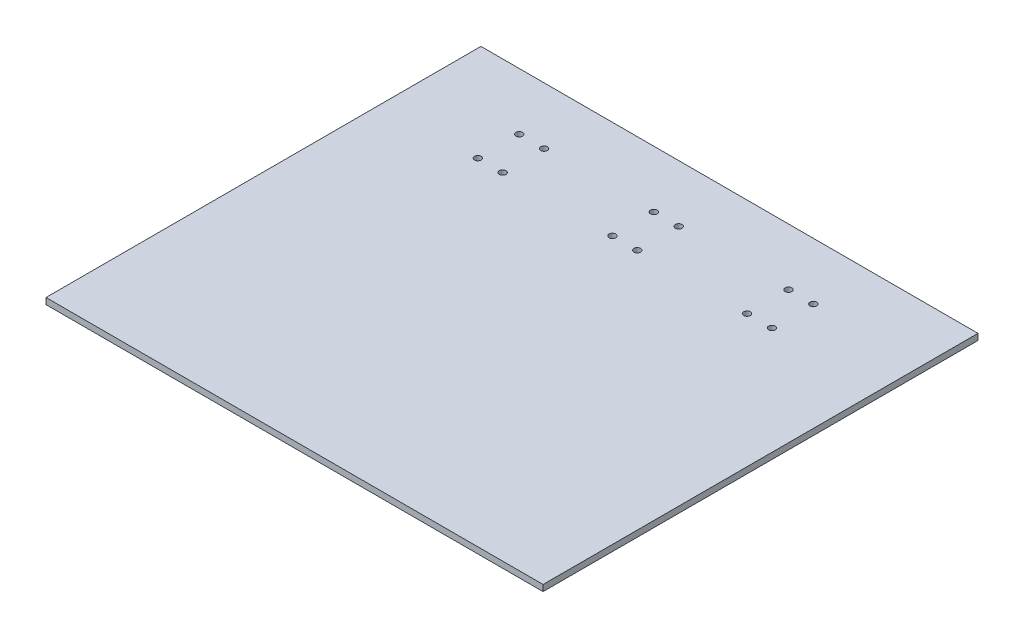
ISO-10303-21;
HEADER;
FILE_DESCRIPTION(('STEP AP214'),'2;1');
FILE_NAME('part.step','',(''),(''),'','','');
FILE_SCHEMA(('AUTOMOTIVE_DESIGN { 1 0 10303 214 1 1 1 1 }'));
ENDSEC;
DATA;
#1=APPLICATION_CONTEXT('core data for automotive mechanical design processes');
#2=APPLICATION_PROTOCOL_DEFINITION('international standard','automotive_design',2000,#1);
#3=PRODUCT_CONTEXT('',#1,'mechanical');
#4=PRODUCT('Part','Part','',(#3));
#5=PRODUCT_RELATED_PRODUCT_CATEGORY('part','',(#4));
#6=PRODUCT_DEFINITION_FORMATION('','',#4);
#7=PRODUCT_DEFINITION_CONTEXT('part definition',#1,'design');
#8=PRODUCT_DEFINITION('design','',#6,#7);
#9=PRODUCT_DEFINITION_SHAPE('','',#8);
#10=(LENGTH_UNIT() NAMED_UNIT(*) SI_UNIT(.MILLI.,.METRE.));
#11=(NAMED_UNIT(*) PLANE_ANGLE_UNIT() SI_UNIT($,.RADIAN.));
#12=(NAMED_UNIT(*) SI_UNIT($,.STERADIAN.) SOLID_ANGLE_UNIT());
#13=UNCERTAINTY_MEASURE_WITH_UNIT(LENGTH_MEASURE(1.E-05),#10,'distance_accuracy_value','');
#14=(GEOMETRIC_REPRESENTATION_CONTEXT(3) GLOBAL_UNCERTAINTY_ASSIGNED_CONTEXT((#13)) GLOBAL_UNIT_ASSIGNED_CONTEXT((#10,
#11,#12)) REPRESENTATION_CONTEXT('',''));
#15=CARTESIAN_POINT('',(0.,0.,0.));
#16=DIRECTION('',(0.,0.,1.));
#17=DIRECTION('',(1.,0.,0.));
#18=AXIS2_PLACEMENT_3D('',#15,#16,#17);
#19=CARTESIAN_POINT('',(-74.,0.,-57.5));
#20=DIRECTION('',(0.,1.,0.));
#21=DIRECTION('',(0.,0.,1.));
#22=AXIS2_PLACEMENT_3D('',#19,#20,#21);
#23=CYLINDRICAL_SURFACE('',#22,1.60000000000001);
#24=CARTESIAN_POINT('',(-74.,3.,-57.5));
#25=DIRECTION('',(0.,1.,0.));
#26=DIRECTION('',(0.,0.,1.));
#27=AXIS2_PLACEMENT_3D('',#24,#25,#26);
#28=CIRCLE('',#27,1.60000000000001);
#29=CARTESIAN_POINT('',(-74.,3.,-55.9));
#30=VERTEX_POINT('',#29);
#31=EDGE_CURVE('E50',#30,#30,#28,.T.);
#32=ORIENTED_EDGE('',*,*,#31,.T.);
#33=EDGE_LOOP('',(#32));
#34=FACE_BOUND('',#33,.T.);
#35=CARTESIAN_POINT('',(-74.,0.,-57.5));
#36=DIRECTION('',(0.,1.,0.));
#37=DIRECTION('',(0.,0.,1.));
#38=AXIS2_PLACEMENT_3D('',#35,#36,#37);
#39=CIRCLE('',#38,1.60000000000001);
#40=CARTESIAN_POINT('',(-74.,0.,-55.9));
#41=VERTEX_POINT('',#40);
#42=EDGE_CURVE('E11',#41,#41,#39,.T.);
#43=ORIENTED_EDGE('',*,*,#42,.F.);
#44=EDGE_LOOP('',(#43));
#45=FACE_BOUND('',#44,.T.);
#46=ADVANCED_FACE('F41',(#34,#45),#23,.F.);
#47=CARTESIAN_POINT('',(-74.,0.,-77.5));
#48=DIRECTION('',(0.,1.,0.));
#49=DIRECTION('',(0.,0.,1.));
#50=AXIS2_PLACEMENT_3D('',#47,#48,#49);
#51=CYLINDRICAL_SURFACE('',#50,1.60000000000001);
#52=CARTESIAN_POINT('',(-74.,3.,-77.5));
#53=DIRECTION('',(0.,1.,0.));
#54=DIRECTION('',(0.,0.,1.));
#55=AXIS2_PLACEMENT_3D('',#52,#53,#54);
#56=CIRCLE('',#55,1.60000000000001);
#57=CARTESIAN_POINT('',(-74.,3.,-75.9));
#58=VERTEX_POINT('',#57);
#59=EDGE_CURVE('E147',#58,#58,#56,.T.);
#60=ORIENTED_EDGE('',*,*,#59,.T.);
#61=EDGE_LOOP('',(#60));
#62=FACE_BOUND('',#61,.T.);
#63=CARTESIAN_POINT('',(-74.,0.,-77.5));
#64=DIRECTION('',(0.,1.,0.));
#65=DIRECTION('',(0.,0.,1.));
#66=AXIS2_PLACEMENT_3D('',#63,#64,#65);
#67=CIRCLE('',#66,1.60000000000001);
#68=CARTESIAN_POINT('',(-74.,0.,-75.9));
#69=VERTEX_POINT('',#68);
#70=EDGE_CURVE('E151',#69,#69,#67,.T.);
#71=ORIENTED_EDGE('',*,*,#70,.F.);
#72=EDGE_LOOP('',(#71));
#73=FACE_BOUND('',#72,.T.);
#74=ADVANCED_FACE('F177',(#62,#73),#51,.F.);
#75=CARTESIAN_POINT('',(-62.,0.,-77.5));
#76=DIRECTION('',(0.,1.,0.));
#77=DIRECTION('',(0.,0.,1.));
#78=AXIS2_PLACEMENT_3D('',#75,#76,#77);
#79=CYLINDRICAL_SURFACE('',#78,1.60000000000001);
#80=CARTESIAN_POINT('',(-62.,3.,-77.5));
#81=DIRECTION('',(0.,1.,0.));
#82=DIRECTION('',(0.,0.,1.));
#83=AXIS2_PLACEMENT_3D('',#80,#81,#82);
#84=CIRCLE('',#83,1.60000000000001);
#85=CARTESIAN_POINT('',(-62.,3.,-75.9));
#86=VERTEX_POINT('',#85);
#87=EDGE_CURVE('E139',#86,#86,#84,.T.);
#88=ORIENTED_EDGE('',*,*,#87,.T.);
#89=EDGE_LOOP('',(#88));
#90=FACE_BOUND('',#89,.T.);
#91=CARTESIAN_POINT('',(-62.,0.,-77.5));
#92=DIRECTION('',(0.,1.,0.));
#93=DIRECTION('',(0.,0.,1.));
#94=AXIS2_PLACEMENT_3D('',#91,#92,#93);
#95=CIRCLE('',#94,1.60000000000001);
#96=CARTESIAN_POINT('',(-62.,0.,-75.9));
#97=VERTEX_POINT('',#96);
#98=EDGE_CURVE('E143',#97,#97,#95,.T.);
#99=ORIENTED_EDGE('',*,*,#98,.F.);
#100=EDGE_LOOP('',(#99));
#101=FACE_BOUND('',#100,.T.);
#102=ADVANCED_FACE('F181',(#90,#101),#79,.F.);
#103=CARTESIAN_POINT('',(-62.,0.,-57.5));
#104=DIRECTION('',(0.,1.,0.));
#105=DIRECTION('',(0.,0.,1.));
#106=AXIS2_PLACEMENT_3D('',#103,#104,#105);
#107=CYLINDRICAL_SURFACE('',#106,1.60000000000001);
#108=CARTESIAN_POINT('',(-62.,3.,-57.5));
#109=DIRECTION('',(0.,1.,0.));
#110=DIRECTION('',(0.,0.,1.));
#111=AXIS2_PLACEMENT_3D('',#108,#109,#110);
#112=CIRCLE('',#111,1.60000000000001);
#113=CARTESIAN_POINT('',(-62.,3.,-55.9));
#114=VERTEX_POINT('',#113);
#115=EDGE_CURVE('E131',#114,#114,#112,.T.);
#116=ORIENTED_EDGE('',*,*,#115,.T.);
#117=EDGE_LOOP('',(#116));
#118=FACE_BOUND('',#117,.T.);
#119=CARTESIAN_POINT('',(-62.,0.,-57.5));
#120=DIRECTION('',(0.,1.,0.));
#121=DIRECTION('',(0.,0.,1.));
#122=AXIS2_PLACEMENT_3D('',#119,#120,#121);
#123=CIRCLE('',#122,1.60000000000001);
#124=CARTESIAN_POINT('',(-62.,0.,-55.9));
#125=VERTEX_POINT('',#124);
#126=EDGE_CURVE('E135',#125,#125,#123,.T.);
#127=ORIENTED_EDGE('',*,*,#126,.F.);
#128=EDGE_LOOP('',(#127));
#129=FACE_BOUND('',#128,.T.);
#130=ADVANCED_FACE('F186',(#118,#129),#107,.F.);
#131=CARTESIAN_POINT('',(120.,3.,-105.));
#132=DIRECTION('',(-1.,0.,0.));
#133=DIRECTION('',(0.,0.,1.));
#134=AXIS2_PLACEMENT_3D('',#131,#132,#133);
#135=PLANE('',#134);
#136=DIRECTION('',(0.,0.,-1.));
#137=VECTOR('',#136,1.);
#138=CARTESIAN_POINT('',(120.,0.,-105.));
#139=LINE('',#138,#137);
#140=CARTESIAN_POINT('',(120.,0.,105.));
#141=VERTEX_POINT('',#140);
#142=CARTESIAN_POINT('',(120.,0.,-105.));
#143=VERTEX_POINT('',#142);
#144=EDGE_CURVE('E114',#141,#143,#139,.T.);
#145=ORIENTED_EDGE('',*,*,#144,.T.);
#146=DIRECTION('',(0.,-1.,0.));
#147=VECTOR('',#146,1.);
#148=CARTESIAN_POINT('',(120.,3.,-105.));
#149=LINE('',#148,#147);
#150=CARTESIAN_POINT('',(120.,3.,-105.));
#151=VERTEX_POINT('',#150);
#152=EDGE_CURVE('E103',#151,#143,#149,.T.);
#153=ORIENTED_EDGE('',*,*,#152,.F.);
#154=DIRECTION('',(0.,0.,-1.));
#155=VECTOR('',#154,1.);
#156=CARTESIAN_POINT('',(120.,3.,-105.));
#157=LINE('',#156,#155);
#158=CARTESIAN_POINT('',(120.,3.,105.));
#159=VERTEX_POINT('',#158);
#160=EDGE_CURVE('E95',#159,#151,#157,.T.);
#161=ORIENTED_EDGE('',*,*,#160,.F.);
#162=DIRECTION('',(0.,-1.,0.));
#163=VECTOR('',#162,1.);
#164=CARTESIAN_POINT('',(120.,3.,105.));
#165=LINE('',#164,#163);
#166=EDGE_CURVE('E110',#159,#141,#165,.T.);
#167=ORIENTED_EDGE('',*,*,#166,.T.);
#168=EDGE_LOOP('',(#145,#153,#161,#167));
#169=FACE_BOUND('',#168,.T.);
#170=ADVANCED_FACE('F193',(#169),#135,.F.);
#171=CARTESIAN_POINT('',(-120.,3.,-105.));
#172=DIRECTION('',(0.,0.,1.));
#173=DIRECTION('',(1.,0.,0.));
#174=AXIS2_PLACEMENT_3D('',#171,#172,#173);
#175=PLANE('',#174);
#176=DIRECTION('',(-1.,0.,0.));
#177=VECTOR('',#176,1.);
#178=CARTESIAN_POINT('',(-120.,0.,-105.));
#179=LINE('',#178,#177);
#180=CARTESIAN_POINT('',(-120.,0.,-105.));
#181=VERTEX_POINT('',#180);
#182=EDGE_CURVE('E101',#143,#181,#179,.T.);
#183=ORIENTED_EDGE('',*,*,#182,.T.);
#184=DIRECTION('',(0.,-1.,0.));
#185=VECTOR('',#184,1.);
#186=CARTESIAN_POINT('',(-120.,3.,-105.));
#187=LINE('',#186,#185);
#188=CARTESIAN_POINT('',(-120.,3.,-105.));
#189=VERTEX_POINT('',#188);
#190=EDGE_CURVE('E99',#189,#181,#187,.T.);
#191=ORIENTED_EDGE('',*,*,#190,.F.);
#192=DIRECTION('',(-1.,0.,0.));
#193=VECTOR('',#192,1.);
#194=CARTESIAN_POINT('',(-120.,3.,-105.));
#195=LINE('',#194,#193);
#196=EDGE_CURVE('E89',#151,#189,#195,.T.);
#197=ORIENTED_EDGE('',*,*,#196,.F.);
#198=ORIENTED_EDGE('',*,*,#152,.T.);
#199=EDGE_LOOP('',(#183,#191,#197,#198));
#200=FACE_BOUND('',#199,.T.);
#201=ADVANCED_FACE('F100',(#200),#175,.F.);
#202=CARTESIAN_POINT('',(-120.,3.,-105.));
#203=DIRECTION('',(1.,0.,0.));
#204=DIRECTION('',(0.,0.,-1.));
#205=AXIS2_PLACEMENT_3D('',#202,#203,#204);
#206=PLANE('',#205);
#207=DIRECTION('',(0.,0.,1.));
#208=VECTOR('',#207,1.);
#209=CARTESIAN_POINT('',(-120.,0.,-105.));
#210=LINE('',#209,#208);
#211=CARTESIAN_POINT('',(-120.,0.,105.));
#212=VERTEX_POINT('',#211);
#213=EDGE_CURVE('E75',#181,#212,#210,.T.);
#214=ORIENTED_EDGE('',*,*,#213,.T.);
#215=DIRECTION('',(0.,-1.,0.));
#216=VECTOR('',#215,1.);
#217=CARTESIAN_POINT('',(-120.,3.,105.));
#218=LINE('',#217,#216);
#219=CARTESIAN_POINT('',(-120.,3.,105.));
#220=VERTEX_POINT('',#219);
#221=EDGE_CURVE('E104',#220,#212,#218,.T.);
#222=ORIENTED_EDGE('',*,*,#221,.F.);
#223=DIRECTION('',(0.,0.,1.));
#224=VECTOR('',#223,1.);
#225=CARTESIAN_POINT('',(-120.,3.,-105.));
#226=LINE('',#225,#224);
#227=EDGE_CURVE('E93',#189,#220,#226,.T.);
#228=ORIENTED_EDGE('',*,*,#227,.F.);
#229=ORIENTED_EDGE('',*,*,#190,.T.);
#230=EDGE_LOOP('',(#214,#222,#228,#229));
#231=FACE_BOUND('',#230,.T.);
#232=ADVANCED_FACE('F106',(#231),#206,.F.);
#233=CARTESIAN_POINT('',(-120.,3.,105.));
#234=DIRECTION('',(0.,0.,-1.));
#235=DIRECTION('',(-1.,0.,0.));
#236=AXIS2_PLACEMENT_3D('',#233,#234,#235);
#237=PLANE('',#236);
#238=DIRECTION('',(1.,0.,0.));
#239=VECTOR('',#238,1.);
#240=CARTESIAN_POINT('',(-120.,0.,105.));
#241=LINE('',#240,#239);
#242=EDGE_CURVE('E81',#212,#141,#241,.T.);
#243=ORIENTED_EDGE('',*,*,#242,.T.);
#244=ORIENTED_EDGE('',*,*,#166,.F.);
#245=DIRECTION('',(1.,0.,0.));
#246=VECTOR('',#245,1.);
#247=CARTESIAN_POINT('',(-120.,3.,105.));
#248=LINE('',#247,#246);
#249=EDGE_CURVE('E58',#220,#159,#248,.T.);
#250=ORIENTED_EDGE('',*,*,#249,.F.);
#251=ORIENTED_EDGE('',*,*,#221,.T.);
#252=EDGE_LOOP('',(#243,#244,#250,#251));
#253=FACE_BOUND('',#252,.T.);
#254=ADVANCED_FACE('F162',(#253),#237,.F.);
#255=CARTESIAN_POINT('',(0.,3.,0.));
#256=DIRECTION('',(0.,1.,0.));
#257=DIRECTION('',(0.,0.,1.));
#258=AXIS2_PLACEMENT_3D('',#255,#256,#257);
#259=PLANE('',#258);
#260=CARTESIAN_POINT('',(-8.99999999999997,3.,-57.5));
#261=DIRECTION('',(0.,1.,0.));
#262=DIRECTION('',(0.,0.,1.));
#263=AXIS2_PLACEMENT_3D('',#260,#261,#262);
#264=CIRCLE('',#263,1.60000000000001);
#265=CARTESIAN_POINT('',(-8.99999999999997,3.,-55.9));
#266=VERTEX_POINT('',#265);
#267=EDGE_CURVE('E322',#266,#266,#264,.T.);
#268=ORIENTED_EDGE('',*,*,#267,.F.);
#269=EDGE_LOOP('',(#268));
#270=FACE_BOUND('',#269,.T.);
#271=CARTESIAN_POINT('',(-8.99999999999998,3.,-77.5));
#272=DIRECTION('',(0.,1.,0.));
#273=DIRECTION('',(0.,0.,1.));
#274=AXIS2_PLACEMENT_3D('',#271,#272,#273);
#275=CIRCLE('',#274,1.60000000000001);
#276=CARTESIAN_POINT('',(-8.99999999999998,3.,-75.9));
#277=VERTEX_POINT('',#276);
#278=EDGE_CURVE('E327',#277,#277,#275,.T.);
#279=ORIENTED_EDGE('',*,*,#278,.F.);
#280=EDGE_LOOP('',(#279));
#281=FACE_BOUND('',#280,.T.);
#282=CARTESIAN_POINT('',(3.00000000000002,3.,-77.5));
#283=DIRECTION('',(0.,1.,0.));
#284=DIRECTION('',(0.,0.,1.));
#285=AXIS2_PLACEMENT_3D('',#282,#283,#284);
#286=CIRCLE('',#285,1.60000000000001);
#287=CARTESIAN_POINT('',(3.00000000000002,3.,-75.9));
#288=VERTEX_POINT('',#287);
#289=EDGE_CURVE('E339',#288,#288,#286,.T.);
#290=ORIENTED_EDGE('',*,*,#289,.F.);
#291=EDGE_LOOP('',(#290));
#292=FACE_BOUND('',#291,.T.);
#293=CARTESIAN_POINT('',(3.00000000000003,3.,-57.5));
#294=DIRECTION('',(0.,1.,0.));
#295=DIRECTION('',(0.,0.,1.));
#296=AXIS2_PLACEMENT_3D('',#293,#294,#295);
#297=CIRCLE('',#296,1.60000000000001);
#298=CARTESIAN_POINT('',(3.00000000000003,3.,-55.9));
#299=VERTEX_POINT('',#298);
#300=EDGE_CURVE('E347',#299,#299,#297,.T.);
#301=ORIENTED_EDGE('',*,*,#300,.F.);
#302=EDGE_LOOP('',(#301));
#303=FACE_BOUND('',#302,.T.);
#304=CARTESIAN_POINT('',(68.,3.,-57.5));
#305=DIRECTION('',(0.,1.,0.));
#306=DIRECTION('',(0.,0.,1.));
#307=AXIS2_PLACEMENT_3D('',#304,#305,#306);
#308=CIRCLE('',#307,1.60000000000001);
#309=CARTESIAN_POINT('',(68.,3.,-55.9));
#310=VERTEX_POINT('',#309);
#311=EDGE_CURVE('E118',#310,#310,#308,.T.);
#312=ORIENTED_EDGE('',*,*,#311,.F.);
#313=EDGE_LOOP('',(#312));
#314=FACE_BOUND('',#313,.T.);
#315=CARTESIAN_POINT('',(56.,3.,-57.5));
#316=DIRECTION('',(0.,1.,0.));
#317=DIRECTION('',(0.,0.,1.));
#318=AXIS2_PLACEMENT_3D('',#315,#316,#317);
#319=CIRCLE('',#318,1.60000000000001);
#320=CARTESIAN_POINT('',(56.,3.,-55.9));
#321=VERTEX_POINT('',#320);
#322=EDGE_CURVE('E379',#321,#321,#319,.T.);
#323=ORIENTED_EDGE('',*,*,#322,.F.);
#324=EDGE_LOOP('',(#323));
#325=FACE_BOUND('',#324,.T.);
#326=CARTESIAN_POINT('',(56.,3.,-77.5));
#327=DIRECTION('',(0.,1.,0.));
#328=DIRECTION('',(0.,0.,1.));
#329=AXIS2_PLACEMENT_3D('',#326,#327,#328);
#330=CIRCLE('',#329,1.60000000000001);
#331=CARTESIAN_POINT('',(56.,3.,-75.9));
#332=VERTEX_POINT('',#331);
#333=EDGE_CURVE('E375',#332,#332,#330,.T.);
#334=ORIENTED_EDGE('',*,*,#333,.F.);
#335=EDGE_LOOP('',(#334));
#336=FACE_BOUND('',#335,.T.);
#337=CARTESIAN_POINT('',(68.,3.,-77.5));
#338=DIRECTION('',(0.,1.,0.));
#339=DIRECTION('',(0.,0.,1.));
#340=AXIS2_PLACEMENT_3D('',#337,#338,#339);
#341=CIRCLE('',#340,1.60000000000001);
#342=CARTESIAN_POINT('',(68.,3.,-75.9));
#343=VERTEX_POINT('',#342);
#344=EDGE_CURVE('E371',#343,#343,#341,.T.);
#345=ORIENTED_EDGE('',*,*,#344,.F.);
#346=EDGE_LOOP('',(#345));
#347=FACE_BOUND('',#346,.T.);
#348=ORIENTED_EDGE('',*,*,#160,.T.);
#349=ORIENTED_EDGE('',*,*,#196,.T.);
#350=ORIENTED_EDGE('',*,*,#227,.T.);
#351=ORIENTED_EDGE('',*,*,#249,.T.);
#352=EDGE_LOOP('',(#348,#349,#350,#351));
#353=FACE_BOUND('',#352,.T.);
#354=ORIENTED_EDGE('',*,*,#115,.F.);
#355=EDGE_LOOP('',(#354));
#356=FACE_BOUND('',#355,.T.);
#357=ORIENTED_EDGE('',*,*,#87,.F.);
#358=EDGE_LOOP('',(#357));
#359=FACE_BOUND('',#358,.T.);
#360=ORIENTED_EDGE('',*,*,#59,.F.);
#361=EDGE_LOOP('',(#360));
#362=FACE_BOUND('',#361,.T.);
#363=ORIENTED_EDGE('',*,*,#31,.F.);
#364=EDGE_LOOP('',(#363));
#365=FACE_BOUND('',#364,.T.);
#366=ADVANCED_FACE('F90',(#270,#281,#292,#303,#314,#325,#336,#347,#353,#356,#359,#362,#365),
#259,.T.);
#367=CARTESIAN_POINT('',(0.,0.,0.));
#368=DIRECTION('',(0.,1.,0.));
#369=DIRECTION('',(0.,0.,1.));
#370=AXIS2_PLACEMENT_3D('',#367,#368,#369);
#371=PLANE('',#370);
#372=CARTESIAN_POINT('',(-8.99999999999997,0.,-57.5));
#373=DIRECTION('',(0.,1.,0.));
#374=DIRECTION('',(0.,0.,1.));
#375=AXIS2_PLACEMENT_3D('',#372,#373,#374);
#376=CIRCLE('',#375,1.60000000000001);
#377=CARTESIAN_POINT('',(-8.99999999999997,0.,-55.9));
#378=VERTEX_POINT('',#377);
#379=EDGE_CURVE('E325',#378,#378,#376,.T.);
#380=ORIENTED_EDGE('',*,*,#379,.T.);
#381=EDGE_LOOP('',(#380));
#382=FACE_BOUND('',#381,.T.);
#383=CARTESIAN_POINT('',(-8.99999999999998,0.,-77.5));
#384=DIRECTION('',(0.,1.,0.));
#385=DIRECTION('',(0.,0.,1.));
#386=AXIS2_PLACEMENT_3D('',#383,#384,#385);
#387=CIRCLE('',#386,1.60000000000001);
#388=CARTESIAN_POINT('',(-8.99999999999998,0.,-75.9));
#389=VERTEX_POINT('',#388);
#390=EDGE_CURVE('E332',#389,#389,#387,.T.);
#391=ORIENTED_EDGE('',*,*,#390,.T.);
#392=EDGE_LOOP('',(#391));
#393=FACE_BOUND('',#392,.T.);
#394=CARTESIAN_POINT('',(3.00000000000002,0.,-77.5));
#395=DIRECTION('',(0.,1.,0.));
#396=DIRECTION('',(0.,0.,1.));
#397=AXIS2_PLACEMENT_3D('',#394,#395,#396);
#398=CIRCLE('',#397,1.60000000000001);
#399=CARTESIAN_POINT('',(3.00000000000002,0.,-75.9));
#400=VERTEX_POINT('',#399);
#401=EDGE_CURVE('E343',#400,#400,#398,.T.);
#402=ORIENTED_EDGE('',*,*,#401,.T.);
#403=EDGE_LOOP('',(#402));
#404=FACE_BOUND('',#403,.T.);
#405=CARTESIAN_POINT('',(3.00000000000003,0.,-57.5));
#406=DIRECTION('',(0.,1.,0.));
#407=DIRECTION('',(0.,0.,1.));
#408=AXIS2_PLACEMENT_3D('',#405,#406,#407);
#409=CIRCLE('',#408,1.60000000000001);
#410=CARTESIAN_POINT('',(3.00000000000003,0.,-55.9));
#411=VERTEX_POINT('',#410);
#412=EDGE_CURVE('E351',#411,#411,#409,.T.);
#413=ORIENTED_EDGE('',*,*,#412,.T.);
#414=EDGE_LOOP('',(#413));
#415=FACE_BOUND('',#414,.T.);
#416=CARTESIAN_POINT('',(68.,0.,-57.5));
#417=DIRECTION('',(0.,1.,0.));
#418=DIRECTION('',(0.,0.,1.));
#419=AXIS2_PLACEMENT_3D('',#416,#417,#418);
#420=CIRCLE('',#419,1.60000000000001);
#421=CARTESIAN_POINT('',(68.,0.,-55.9));
#422=VERTEX_POINT('',#421);
#423=EDGE_CURVE('E355',#422,#422,#420,.T.);
#424=ORIENTED_EDGE('',*,*,#423,.T.);
#425=EDGE_LOOP('',(#424));
#426=FACE_BOUND('',#425,.T.);
#427=CARTESIAN_POINT('',(56.,0.,-57.5));
#428=DIRECTION('',(0.,1.,0.));
#429=DIRECTION('',(0.,0.,1.));
#430=AXIS2_PLACEMENT_3D('',#427,#428,#429);
#431=CIRCLE('',#430,1.60000000000001);
#432=CARTESIAN_POINT('',(56.,0.,-55.9));
#433=VERTEX_POINT('',#432);
#434=EDGE_CURVE('E361',#433,#433,#431,.T.);
#435=ORIENTED_EDGE('',*,*,#434,.T.);
#436=EDGE_LOOP('',(#435));
#437=FACE_BOUND('',#436,.T.);
#438=CARTESIAN_POINT('',(56.,0.,-77.5));
#439=DIRECTION('',(0.,1.,0.));
#440=DIRECTION('',(0.,0.,1.));
#441=AXIS2_PLACEMENT_3D('',#438,#439,#440);
#442=CIRCLE('',#441,1.60000000000001);
#443=CARTESIAN_POINT('',(56.,0.,-75.9));
#444=VERTEX_POINT('',#443);
#445=EDGE_CURVE('E356',#444,#444,#442,.T.);
#446=ORIENTED_EDGE('',*,*,#445,.T.);
#447=EDGE_LOOP('',(#446));
#448=FACE_BOUND('',#447,.T.);
#449=CARTESIAN_POINT('',(68.,0.,-77.5));
#450=DIRECTION('',(0.,1.,0.));
#451=DIRECTION('',(0.,0.,1.));
#452=AXIS2_PLACEMENT_3D('',#449,#450,#451);
#453=CIRCLE('',#452,1.60000000000001);
#454=CARTESIAN_POINT('',(68.,0.,-75.9));
#455=VERTEX_POINT('',#454);
#456=EDGE_CURVE('E360',#455,#455,#453,.T.);
#457=ORIENTED_EDGE('',*,*,#456,.T.);
#458=EDGE_LOOP('',(#457));
#459=FACE_BOUND('',#458,.T.);
#460=ORIENTED_EDGE('',*,*,#144,.F.);
#461=ORIENTED_EDGE('',*,*,#242,.F.);
#462=ORIENTED_EDGE('',*,*,#213,.F.);
#463=ORIENTED_EDGE('',*,*,#182,.F.);
#464=EDGE_LOOP('',(#460,#461,#462,#463));
#465=FACE_BOUND('',#464,.T.);
#466=ORIENTED_EDGE('',*,*,#126,.T.);
#467=EDGE_LOOP('',(#466));
#468=FACE_BOUND('',#467,.T.);
#469=ORIENTED_EDGE('',*,*,#98,.T.);
#470=EDGE_LOOP('',(#469));
#471=FACE_BOUND('',#470,.T.);
#472=ORIENTED_EDGE('',*,*,#70,.T.);
#473=EDGE_LOOP('',(#472));
#474=FACE_BOUND('',#473,.T.);
#475=ORIENTED_EDGE('',*,*,#42,.T.);
#476=EDGE_LOOP('',(#475));
#477=FACE_BOUND('',#476,.T.);
#478=ADVANCED_FACE('F161',(#382,#393,#404,#415,#426,#437,#448,#459,#465,#468,#471,#474,#477),
#371,.F.);
#479=CARTESIAN_POINT('',(68.,0.,-77.5));
#480=DIRECTION('',(0.,1.,0.));
#481=DIRECTION('',(0.,0.,1.));
#482=AXIS2_PLACEMENT_3D('',#479,#480,#481);
#483=CYLINDRICAL_SURFACE('',#482,1.60000000000001);
#484=ORIENTED_EDGE('',*,*,#344,.T.);
#485=EDGE_LOOP('',(#484));
#486=FACE_BOUND('',#485,.T.);
#487=ORIENTED_EDGE('',*,*,#456,.F.);
#488=EDGE_LOOP('',(#487));
#489=FACE_BOUND('',#488,.T.);
#490=ADVANCED_FACE('F169',(#486,#489),#483,.F.);
#491=CARTESIAN_POINT('',(56.,0.,-77.5));
#492=DIRECTION('',(0.,1.,0.));
#493=DIRECTION('',(0.,0.,1.));
#494=AXIS2_PLACEMENT_3D('',#491,#492,#493);
#495=CYLINDRICAL_SURFACE('',#494,1.60000000000001);
#496=ORIENTED_EDGE('',*,*,#333,.T.);
#497=EDGE_LOOP('',(#496));
#498=FACE_BOUND('',#497,.T.);
#499=ORIENTED_EDGE('',*,*,#445,.F.);
#500=EDGE_LOOP('',(#499));
#501=FACE_BOUND('',#500,.T.);
#502=ADVANCED_FACE('F219',(#498,#501),#495,.F.);
#503=CARTESIAN_POINT('',(56.,0.,-57.5));
#504=DIRECTION('',(0.,1.,0.));
#505=DIRECTION('',(0.,0.,1.));
#506=AXIS2_PLACEMENT_3D('',#503,#504,#505);
#507=CYLINDRICAL_SURFACE('',#506,1.60000000000001);
#508=ORIENTED_EDGE('',*,*,#322,.T.);
#509=EDGE_LOOP('',(#508));
#510=FACE_BOUND('',#509,.T.);
#511=ORIENTED_EDGE('',*,*,#434,.F.);
#512=EDGE_LOOP('',(#511));
#513=FACE_BOUND('',#512,.T.);
#514=ADVANCED_FACE('F229',(#510,#513),#507,.F.);
#515=CARTESIAN_POINT('',(68.,0.,-57.5));
#516=DIRECTION('',(0.,1.,0.));
#517=DIRECTION('',(0.,0.,1.));
#518=AXIS2_PLACEMENT_3D('',#515,#516,#517);
#519=CYLINDRICAL_SURFACE('',#518,1.60000000000001);
#520=ORIENTED_EDGE('',*,*,#311,.T.);
#521=EDGE_LOOP('',(#520));
#522=FACE_BOUND('',#521,.T.);
#523=ORIENTED_EDGE('',*,*,#423,.F.);
#524=EDGE_LOOP('',(#523));
#525=FACE_BOUND('',#524,.T.);
#526=ADVANCED_FACE('F239',(#522,#525),#519,.F.);
#527=CARTESIAN_POINT('',(3.00000000000003,0.,-57.5));
#528=DIRECTION('',(0.,1.,0.));
#529=DIRECTION('',(0.,0.,1.));
#530=AXIS2_PLACEMENT_3D('',#527,#528,#529);
#531=CYLINDRICAL_SURFACE('',#530,1.60000000000001);
#532=ORIENTED_EDGE('',*,*,#300,.T.);
#533=EDGE_LOOP('',(#532));
#534=FACE_BOUND('',#533,.T.);
#535=ORIENTED_EDGE('',*,*,#412,.F.);
#536=EDGE_LOOP('',(#535));
#537=FACE_BOUND('',#536,.T.);
#538=ADVANCED_FACE('F248',(#534,#537),#531,.F.);
#539=CARTESIAN_POINT('',(3.00000000000002,0.,-77.5));
#540=DIRECTION('',(0.,1.,0.));
#541=DIRECTION('',(0.,0.,1.));
#542=AXIS2_PLACEMENT_3D('',#539,#540,#541);
#543=CYLINDRICAL_SURFACE('',#542,1.60000000000001);
#544=ORIENTED_EDGE('',*,*,#289,.T.);
#545=EDGE_LOOP('',(#544));
#546=FACE_BOUND('',#545,.T.);
#547=ORIENTED_EDGE('',*,*,#401,.F.);
#548=EDGE_LOOP('',(#547));
#549=FACE_BOUND('',#548,.T.);
#550=ADVANCED_FACE('F286',(#546,#549),#543,.F.);
#551=CARTESIAN_POINT('',(-8.99999999999998,0.,-77.5));
#552=DIRECTION('',(0.,1.,0.));
#553=DIRECTION('',(0.,0.,1.));
#554=AXIS2_PLACEMENT_3D('',#551,#552,#553);
#555=CYLINDRICAL_SURFACE('',#554,1.60000000000001);
#556=ORIENTED_EDGE('',*,*,#278,.T.);
#557=EDGE_LOOP('',(#556));
#558=FACE_BOUND('',#557,.T.);
#559=ORIENTED_EDGE('',*,*,#390,.F.);
#560=EDGE_LOOP('',(#559));
#561=FACE_BOUND('',#560,.T.);
#562=ADVANCED_FACE('F296',(#558,#561),#555,.F.);
#563=CARTESIAN_POINT('',(-8.99999999999997,0.,-57.5));
#564=DIRECTION('',(0.,1.,0.));
#565=DIRECTION('',(0.,0.,1.));
#566=AXIS2_PLACEMENT_3D('',#563,#564,#565);
#567=CYLINDRICAL_SURFACE('',#566,1.60000000000001);
#568=ORIENTED_EDGE('',*,*,#267,.T.);
#569=EDGE_LOOP('',(#568));
#570=FACE_BOUND('',#569,.T.);
#571=ORIENTED_EDGE('',*,*,#379,.F.);
#572=EDGE_LOOP('',(#571));
#573=FACE_BOUND('',#572,.T.);
#574=ADVANCED_FACE('F306',(#570,#573),#567,.F.);
#575=CLOSED_SHELL('',(#46,#74,#102,#130,#170,#201,#232,#254,#366,#478,#490,#502,#514,#526,#538,
#550,#562,#574));
#576=MANIFOLD_SOLID_BREP('B2',#575);
#577=ADVANCED_BREP_SHAPE_REPRESENTATION('',(#18,#576),#14);
#578=SHAPE_DEFINITION_REPRESENTATION(#9,#577);
ENDSEC;
END-ISO-10303-21;
